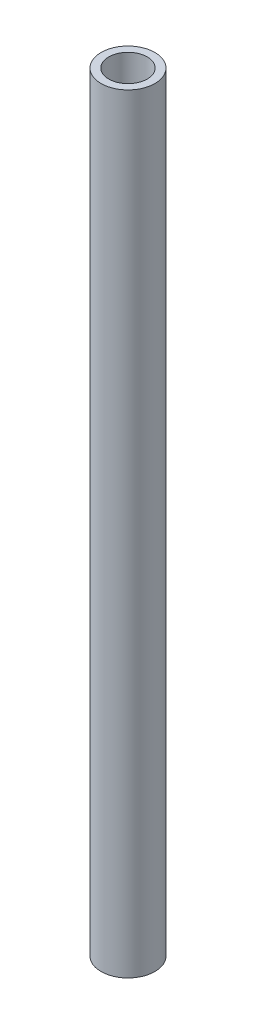
ISO-10303-21;
HEADER;
FILE_DESCRIPTION(('STEP AP214'),'2;1');
FILE_NAME('part.step','',(''),(''),'','','');
FILE_SCHEMA(('AUTOMOTIVE_DESIGN { 1 0 10303 214 1 1 1 1 }'));
ENDSEC;
DATA;
#1=APPLICATION_CONTEXT('core data for automotive mechanical design processes');
#2=APPLICATION_PROTOCOL_DEFINITION('international standard','automotive_design',2000,#1);
#3=PRODUCT_CONTEXT('',#1,'mechanical');
#4=PRODUCT('Part','Part','',(#3));
#5=PRODUCT_RELATED_PRODUCT_CATEGORY('part','',(#4));
#6=PRODUCT_DEFINITION_FORMATION('','',#4);
#7=PRODUCT_DEFINITION_CONTEXT('part definition',#1,'design');
#8=PRODUCT_DEFINITION('design','',#6,#7);
#9=PRODUCT_DEFINITION_SHAPE('','',#8);
#10=(LENGTH_UNIT() NAMED_UNIT(*) SI_UNIT(.MILLI.,.METRE.));
#11=(NAMED_UNIT(*) PLANE_ANGLE_UNIT() SI_UNIT($,.RADIAN.));
#12=(NAMED_UNIT(*) SI_UNIT($,.STERADIAN.) SOLID_ANGLE_UNIT());
#13=UNCERTAINTY_MEASURE_WITH_UNIT(LENGTH_MEASURE(1.E-05),#10,'distance_accuracy_value','');
#14=(GEOMETRIC_REPRESENTATION_CONTEXT(3) GLOBAL_UNCERTAINTY_ASSIGNED_CONTEXT((#13)) GLOBAL_UNIT_ASSIGNED_CONTEXT((#10,
#11,#12)) REPRESENTATION_CONTEXT('',''));
#15=CARTESIAN_POINT('',(0.,0.,0.));
#16=DIRECTION('',(0.,0.,1.));
#17=DIRECTION('',(1.,0.,0.));
#18=AXIS2_PLACEMENT_3D('',#15,#16,#17);
#19=CARTESIAN_POINT('',(0.,381.,0.));
#20=DIRECTION('',(0.,1.,0.));
#21=DIRECTION('',(0.,0.,1.));
#22=AXIS2_PLACEMENT_3D('',#19,#20,#21);
#23=PLANE('',#22);
#24=CARTESIAN_POINT('',(0.,381.,0.));
#25=DIRECTION('',(0.,1.,0.));
#26=DIRECTION('',(0.,0.,1.));
#27=AXIS2_PLACEMENT_3D('',#24,#25,#26);
#28=CIRCLE('',#27,13.335);
#29=CARTESIAN_POINT('',(0.,381.,13.335));
#30=VERTEX_POINT('',#29);
#31=EDGE_CURVE('E10',#30,#30,#28,.T.);
#32=ORIENTED_EDGE('',*,*,#31,.T.);
#33=EDGE_LOOP('',(#32));
#34=FACE_BOUND('',#33,.T.);
#35=CARTESIAN_POINT('',(0.,381.,0.));
#36=DIRECTION('',(0.,1.,0.));
#37=DIRECTION('',(0.,0.,1.));
#38=AXIS2_PLACEMENT_3D('',#35,#36,#37);
#39=CIRCLE('',#38,9.525);
#40=CARTESIAN_POINT('',(0.,381.,9.525));
#41=VERTEX_POINT('',#40);
#42=EDGE_CURVE('E56',#41,#41,#39,.T.);
#43=ORIENTED_EDGE('',*,*,#42,.F.);
#44=EDGE_LOOP('',(#43));
#45=FACE_BOUND('',#44,.T.);
#46=ADVANCED_FACE('F43',(#34,#45),#23,.T.);
#47=CARTESIAN_POINT('',(0.,0.,0.));
#48=DIRECTION('',(0.,1.,0.));
#49=DIRECTION('',(0.,0.,1.));
#50=AXIS2_PLACEMENT_3D('',#47,#48,#49);
#51=PLANE('',#50);
#52=CARTESIAN_POINT('',(0.,0.,0.));
#53=DIRECTION('',(0.,1.,0.));
#54=DIRECTION('',(0.,0.,1.));
#55=AXIS2_PLACEMENT_3D('',#52,#53,#54);
#56=CIRCLE('',#55,13.335);
#57=CARTESIAN_POINT('',(0.,0.,13.335));
#58=VERTEX_POINT('',#57);
#59=EDGE_CURVE('E47',#58,#58,#56,.T.);
#60=ORIENTED_EDGE('',*,*,#59,.F.);
#61=EDGE_LOOP('',(#60));
#62=FACE_BOUND('',#61,.T.);
#63=CARTESIAN_POINT('',(0.,0.,0.));
#64=DIRECTION('',(0.,1.,0.));
#65=DIRECTION('',(0.,0.,1.));
#66=AXIS2_PLACEMENT_3D('',#63,#64,#65);
#67=CIRCLE('',#66,9.525);
#68=CARTESIAN_POINT('',(0.,0.,9.525));
#69=VERTEX_POINT('',#68);
#70=EDGE_CURVE('E58',#69,#69,#67,.T.);
#71=ORIENTED_EDGE('',*,*,#70,.T.);
#72=EDGE_LOOP('',(#71));
#73=FACE_BOUND('',#72,.T.);
#74=ADVANCED_FACE('F70',(#62,#73),#51,.F.);
#75=CARTESIAN_POINT('',(0.,381.,0.));
#76=DIRECTION('',(0.,-1.,0.));
#77=DIRECTION('',(0.,0.,-1.));
#78=AXIS2_PLACEMENT_3D('',#75,#76,#77);
#79=CYLINDRICAL_SURFACE('',#78,13.335);
#80=ORIENTED_EDGE('',*,*,#31,.F.);
#81=EDGE_LOOP('',(#80));
#82=FACE_BOUND('',#81,.T.);
#83=ORIENTED_EDGE('',*,*,#59,.T.);
#84=EDGE_LOOP('',(#83));
#85=FACE_BOUND('',#84,.T.);
#86=ADVANCED_FACE('F45',(#82,#85),#79,.T.);
#87=CARTESIAN_POINT('',(0.,381.,0.));
#88=DIRECTION('',(0.,-1.,0.));
#89=DIRECTION('',(0.,0.,-1.));
#90=AXIS2_PLACEMENT_3D('',#87,#88,#89);
#91=CYLINDRICAL_SURFACE('',#90,9.525);
#92=ORIENTED_EDGE('',*,*,#42,.T.);
#93=EDGE_LOOP('',(#92));
#94=FACE_BOUND('',#93,.T.);
#95=ORIENTED_EDGE('',*,*,#70,.F.);
#96=EDGE_LOOP('',(#95));
#97=FACE_BOUND('',#96,.T.);
#98=ADVANCED_FACE('F66',(#94,#97),#91,.F.);
#99=CLOSED_SHELL('',(#46,#74,#86,#98));
#100=MANIFOLD_SOLID_BREP('B2',#99);
#101=ADVANCED_BREP_SHAPE_REPRESENTATION('',(#18,#100),#14);
#102=SHAPE_DEFINITION_REPRESENTATION(#9,#101);
ENDSEC;
END-ISO-10303-21;
